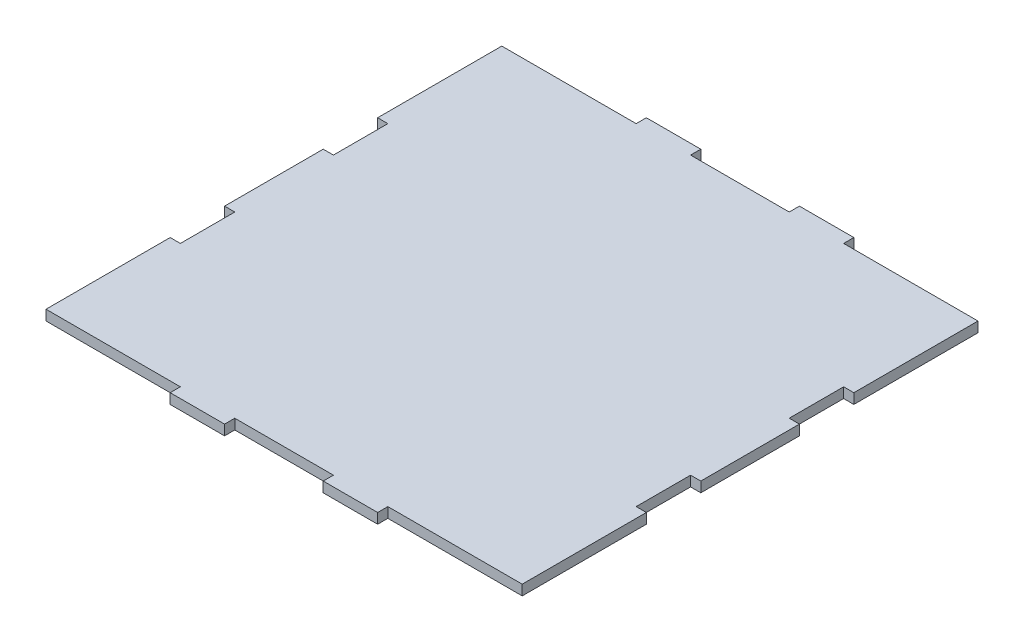
ISO-10303-21;
HEADER;
FILE_DESCRIPTION(('STEP AP214'),'2;1');
FILE_NAME('part.step','',(''),(''),'','','');
FILE_SCHEMA(('AUTOMOTIVE_DESIGN { 1 0 10303 214 1 1 1 1 }'));
ENDSEC;
DATA;
#1=APPLICATION_CONTEXT('core data for automotive mechanical design processes');
#2=APPLICATION_PROTOCOL_DEFINITION('international standard','automotive_design',2000,#1);
#3=PRODUCT_CONTEXT('',#1,'mechanical');
#4=PRODUCT('Part','Part','',(#3));
#5=PRODUCT_RELATED_PRODUCT_CATEGORY('part','',(#4));
#6=PRODUCT_DEFINITION_FORMATION('','',#4);
#7=PRODUCT_DEFINITION_CONTEXT('part definition',#1,'design');
#8=PRODUCT_DEFINITION('design','',#6,#7);
#9=PRODUCT_DEFINITION_SHAPE('','',#8);
#10=(LENGTH_UNIT() NAMED_UNIT(*) SI_UNIT(.MILLI.,.METRE.));
#11=(NAMED_UNIT(*) PLANE_ANGLE_UNIT() SI_UNIT($,.RADIAN.));
#12=(NAMED_UNIT(*) SI_UNIT($,.STERADIAN.) SOLID_ANGLE_UNIT());
#13=UNCERTAINTY_MEASURE_WITH_UNIT(LENGTH_MEASURE(1.E-05),#10,'distance_accuracy_value','');
#14=(GEOMETRIC_REPRESENTATION_CONTEXT(3) GLOBAL_UNCERTAINTY_ASSIGNED_CONTEXT((#13)) GLOBAL_UNIT_ASSIGNED_CONTEXT((#10,
#11,#12)) REPRESENTATION_CONTEXT('',''));
#15=CARTESIAN_POINT('',(0.,0.,0.));
#16=DIRECTION('',(0.,0.,1.));
#17=DIRECTION('',(1.,0.,0.));
#18=AXIS2_PLACEMENT_3D('',#15,#16,#17);
#19=CARTESIAN_POINT('',(70.,3.,70.));
#20=DIRECTION('',(-1.,0.,0.));
#21=DIRECTION('',(0.,0.,1.));
#22=AXIS2_PLACEMENT_3D('',#19,#20,#21);
#23=PLANE('',#22);
#24=DIRECTION('',(0.,0.,-1.));
#25=VECTOR('',#24,1.);
#26=CARTESIAN_POINT('',(70.,3.,70.));
#27=LINE('',#26,#25);
#28=CARTESIAN_POINT('',(70.,3.,-30.5));
#29=VERTEX_POINT('',#28);
#30=CARTESIAN_POINT('',(70.,3.,-67.));
#31=VERTEX_POINT('',#30);
#32=EDGE_CURVE('E342',#29,#31,#27,.T.);
#33=ORIENTED_EDGE('',*,*,#32,.F.);
#34=DIRECTION('',(0.,1.,0.));
#35=VECTOR('',#34,1.);
#36=CARTESIAN_POINT('',(70.,0.,-30.5));
#37=LINE('',#36,#35);
#38=CARTESIAN_POINT('',(70.,0.,-30.5));
#39=VERTEX_POINT('',#38);
#40=EDGE_CURVE('E578',#39,#29,#37,.T.);
#41=ORIENTED_EDGE('',*,*,#40,.F.);
#42=DIRECTION('',(0.,0.,-1.));
#43=VECTOR('',#42,1.);
#44=CARTESIAN_POINT('',(70.,0.,70.));
#45=LINE('',#44,#43);
#46=CARTESIAN_POINT('',(70.,0.,-67.));
#47=VERTEX_POINT('',#46);
#48=EDGE_CURVE('E306',#39,#47,#45,.T.);
#49=ORIENTED_EDGE('',*,*,#48,.T.);
#50=DIRECTION('',(0.,1.,0.));
#51=VECTOR('',#50,1.);
#52=CARTESIAN_POINT('',(70.,0.,-67.));
#53=LINE('',#52,#51);
#54=EDGE_CURVE('E408',#47,#31,#53,.T.);
#55=ORIENTED_EDGE('',*,*,#54,.T.);
#56=EDGE_LOOP('',(#33,#41,#49,#55));
#57=FACE_BOUND('',#56,.T.);
#58=ADVANCED_FACE('F39',(#57),#23,.F.);
#59=CARTESIAN_POINT('',(70.,0.,67.));
#60=VERTEX_POINT('',#59);
#61=CARTESIAN_POINT('',(70.,0.,30.5));
#62=VERTEX_POINT('',#61);
#63=EDGE_CURVE('E293',#60,#62,#45,.T.);
#64=ORIENTED_EDGE('',*,*,#63,.T.);
#65=DIRECTION('',(0.,1.,0.));
#66=VECTOR('',#65,1.);
#67=CARTESIAN_POINT('',(70.,0.,30.5));
#68=LINE('',#67,#66);
#69=CARTESIAN_POINT('',(70.,3.,30.5));
#70=VERTEX_POINT('',#69);
#71=EDGE_CURVE('E275',#62,#70,#68,.T.);
#72=ORIENTED_EDGE('',*,*,#71,.T.);
#73=CARTESIAN_POINT('',(70.,3.,67.));
#74=VERTEX_POINT('',#73);
#75=EDGE_CURVE('E337',#74,#70,#27,.T.);
#76=ORIENTED_EDGE('',*,*,#75,.F.);
#77=DIRECTION('',(0.,1.,0.));
#78=VECTOR('',#77,1.);
#79=CARTESIAN_POINT('',(70.,0.,67.));
#80=LINE('',#79,#78);
#81=EDGE_CURVE('E301',#60,#74,#80,.T.);
#82=ORIENTED_EDGE('',*,*,#81,.F.);
#83=EDGE_LOOP('',(#64,#72,#76,#82));
#84=FACE_BOUND('',#83,.T.);
#85=ADVANCED_FACE('F300',(#84),#23,.F.);
#86=CARTESIAN_POINT('',(-70.,3.,70.));
#87=DIRECTION('',(1.,0.,0.));
#88=DIRECTION('',(0.,0.,-1.));
#89=AXIS2_PLACEMENT_3D('',#86,#87,#88);
#90=PLANE('',#89);
#91=DIRECTION('',(0.,0.,1.));
#92=VECTOR('',#91,1.);
#93=CARTESIAN_POINT('',(-70.,3.,70.));
#94=LINE('',#93,#92);
#95=CARTESIAN_POINT('',(-70.,3.,30.5));
#96=VERTEX_POINT('',#95);
#97=CARTESIAN_POINT('',(-70.,3.,67.));
#98=VERTEX_POINT('',#97);
#99=EDGE_CURVE('E350',#96,#98,#94,.T.);
#100=ORIENTED_EDGE('',*,*,#99,.F.);
#101=DIRECTION('',(0.,1.,0.));
#102=VECTOR('',#101,1.);
#103=CARTESIAN_POINT('',(-70.,0.,30.5));
#104=LINE('',#103,#102);
#105=CARTESIAN_POINT('',(-70.,0.,30.5));
#106=VERTEX_POINT('',#105);
#107=EDGE_CURVE('E544',#106,#96,#104,.T.);
#108=ORIENTED_EDGE('',*,*,#107,.F.);
#109=DIRECTION('',(0.,0.,1.));
#110=VECTOR('',#109,1.);
#111=CARTESIAN_POINT('',(-70.,0.,70.));
#112=LINE('',#111,#110);
#113=CARTESIAN_POINT('',(-70.,0.,67.));
#114=VERTEX_POINT('',#113);
#115=EDGE_CURVE('E671',#106,#114,#112,.T.);
#116=ORIENTED_EDGE('',*,*,#115,.T.);
#117=DIRECTION('',(0.,1.,0.));
#118=VECTOR('',#117,1.);
#119=CARTESIAN_POINT('',(-70.,0.,67.));
#120=LINE('',#119,#118);
#121=EDGE_CURVE('E465',#114,#98,#120,.T.);
#122=ORIENTED_EDGE('',*,*,#121,.T.);
#123=EDGE_LOOP('',(#100,#108,#116,#122));
#124=FACE_BOUND('',#123,.T.);
#125=ADVANCED_FACE('F668',(#124),#90,.F.);
#126=CARTESIAN_POINT('',(-70.,0.,-67.));
#127=VERTEX_POINT('',#126);
#128=CARTESIAN_POINT('',(-70.,0.,-30.5));
#129=VERTEX_POINT('',#128);
#130=EDGE_CURVE('E674',#127,#129,#112,.T.);
#131=ORIENTED_EDGE('',*,*,#130,.T.);
#132=DIRECTION('',(0.,1.,0.));
#133=VECTOR('',#132,1.);
#134=CARTESIAN_POINT('',(-70.,0.,-30.5));
#135=LINE('',#134,#133);
#136=CARTESIAN_POINT('',(-70.,3.,-30.5));
#137=VERTEX_POINT('',#136);
#138=EDGE_CURVE('E608',#129,#137,#135,.T.);
#139=ORIENTED_EDGE('',*,*,#138,.T.);
#140=CARTESIAN_POINT('',(-70.,3.,-67.));
#141=VERTEX_POINT('',#140);
#142=EDGE_CURVE('E346',#141,#137,#94,.T.);
#143=ORIENTED_EDGE('',*,*,#142,.F.);
#144=DIRECTION('',(0.,1.,0.));
#145=VECTOR('',#144,1.);
#146=CARTESIAN_POINT('',(-70.,0.,-67.));
#147=LINE('',#146,#145);
#148=EDGE_CURVE('E328',#127,#141,#147,.T.);
#149=ORIENTED_EDGE('',*,*,#148,.F.);
#150=EDGE_LOOP('',(#131,#139,#143,#149));
#151=FACE_BOUND('',#150,.T.);
#152=ADVANCED_FACE('F767',(#151),#90,.F.);
#153=CARTESIAN_POINT('',(-70.,3.,-70.));
#154=DIRECTION('',(0.,0.,1.));
#155=DIRECTION('',(1.,0.,0.));
#156=AXIS2_PLACEMENT_3D('',#153,#154,#155);
#157=PLANE('',#156);
#158=DIRECTION('',(-1.,0.,0.));
#159=VECTOR('',#158,1.);
#160=CARTESIAN_POINT('',(-70.,3.,-70.));
#161=LINE('',#160,#159);
#162=CARTESIAN_POINT('',(30.5,3.,-70.));
#163=VERTEX_POINT('',#162);
#164=CARTESIAN_POINT('',(14.5,3.,-70.));
#165=VERTEX_POINT('',#164);
#166=EDGE_CURVE('E345',#163,#165,#161,.T.);
#167=ORIENTED_EDGE('',*,*,#166,.F.);
#168=DIRECTION('',(0.,1.,0.));
#169=VECTOR('',#168,1.);
#170=CARTESIAN_POINT('',(30.5,0.,-70.));
#171=LINE('',#170,#169);
#172=CARTESIAN_POINT('',(30.5,0.,-70.));
#173=VERTEX_POINT('',#172);
#174=EDGE_CURVE('E404',#173,#163,#171,.T.);
#175=ORIENTED_EDGE('',*,*,#174,.F.);
#176=DIRECTION('',(-1.,0.,0.));
#177=VECTOR('',#176,1.);
#178=CARTESIAN_POINT('',(-70.,0.,-70.));
#179=LINE('',#178,#177);
#180=CARTESIAN_POINT('',(14.5,0.,-70.));
#181=VERTEX_POINT('',#180);
#182=EDGE_CURVE('E310',#173,#181,#179,.T.);
#183=ORIENTED_EDGE('',*,*,#182,.T.);
#184=DIRECTION('',(0.,1.,0.));
#185=VECTOR('',#184,1.);
#186=CARTESIAN_POINT('',(14.5,0.,-70.));
#187=LINE('',#186,#185);
#188=EDGE_CURVE('E400',#181,#165,#187,.T.);
#189=ORIENTED_EDGE('',*,*,#188,.T.);
#190=EDGE_LOOP('',(#167,#175,#183,#189));
#191=FACE_BOUND('',#190,.T.);
#192=ADVANCED_FACE('F719',(#191),#157,.F.);
#193=CARTESIAN_POINT('',(-70.,3.,70.));
#194=DIRECTION('',(0.,0.,-1.));
#195=DIRECTION('',(-1.,0.,0.));
#196=AXIS2_PLACEMENT_3D('',#193,#194,#195);
#197=PLANE('',#196);
#198=DIRECTION('',(1.,0.,0.));
#199=VECTOR('',#198,1.);
#200=CARTESIAN_POINT('',(-70.,0.,70.));
#201=LINE('',#200,#199);
#202=CARTESIAN_POINT('',(14.5,0.,70.));
#203=VERTEX_POINT('',#202);
#204=CARTESIAN_POINT('',(30.5,0.,70.));
#205=VERTEX_POINT('',#204);
#206=EDGE_CURVE('E43',#203,#205,#201,.T.);
#207=ORIENTED_EDGE('',*,*,#206,.T.);
#208=DIRECTION('',(0.,1.,0.));
#209=VECTOR('',#208,1.);
#210=CARTESIAN_POINT('',(30.5,0.,70.));
#211=LINE('',#210,#209);
#212=CARTESIAN_POINT('',(30.5,3.,70.));
#213=VERTEX_POINT('',#212);
#214=EDGE_CURVE('E371',#205,#213,#211,.T.);
#215=ORIENTED_EDGE('',*,*,#214,.T.);
#216=DIRECTION('',(1.,0.,0.));
#217=VECTOR('',#216,1.);
#218=CARTESIAN_POINT('',(-70.,3.,70.));
#219=LINE('',#218,#217);
#220=CARTESIAN_POINT('',(14.5,3.,70.));
#221=VERTEX_POINT('',#220);
#222=EDGE_CURVE('E49',#221,#213,#219,.T.);
#223=ORIENTED_EDGE('',*,*,#222,.F.);
#224=DIRECTION('',(0.,1.,0.));
#225=VECTOR('',#224,1.);
#226=CARTESIAN_POINT('',(14.5,0.,70.));
#227=LINE('',#226,#225);
#228=EDGE_CURVE('E369',#203,#221,#227,.T.);
#229=ORIENTED_EDGE('',*,*,#228,.F.);
#230=EDGE_LOOP('',(#207,#215,#223,#229));
#231=FACE_BOUND('',#230,.T.);
#232=ADVANCED_FACE('F368',(#231),#197,.F.);
#233=CARTESIAN_POINT('',(70.,0.,14.5));
#234=VERTEX_POINT('',#233);
#235=CARTESIAN_POINT('',(70.,0.,-14.5));
#236=VERTEX_POINT('',#235);
#237=EDGE_CURVE('E304',#234,#236,#45,.T.);
#238=ORIENTED_EDGE('',*,*,#237,.T.);
#239=DIRECTION('',(0.,1.,0.));
#240=VECTOR('',#239,1.);
#241=CARTESIAN_POINT('',(70.,0.,-14.5));
#242=LINE('',#241,#240);
#243=CARTESIAN_POINT('',(70.,3.,-14.5));
#244=VERTEX_POINT('',#243);
#245=EDGE_CURVE('E581',#236,#244,#242,.T.);
#246=ORIENTED_EDGE('',*,*,#245,.T.);
#247=CARTESIAN_POINT('',(70.,3.,14.5));
#248=VERTEX_POINT('',#247);
#249=EDGE_CURVE('E341',#248,#244,#27,.T.);
#250=ORIENTED_EDGE('',*,*,#249,.F.);
#251=DIRECTION('',(0.,1.,0.));
#252=VECTOR('',#251,1.);
#253=CARTESIAN_POINT('',(70.,0.,14.5));
#254=LINE('',#253,#252);
#255=EDGE_CURVE('E286',#234,#248,#254,.T.);
#256=ORIENTED_EDGE('',*,*,#255,.F.);
#257=EDGE_LOOP('',(#238,#246,#250,#256));
#258=FACE_BOUND('',#257,.T.);
#259=ADVANCED_FACE('F41',(#258),#23,.F.);
#260=CARTESIAN_POINT('',(-14.5,3.,-70.));
#261=VERTEX_POINT('',#260);
#262=CARTESIAN_POINT('',(-30.5,3.,-70.));
#263=VERTEX_POINT('',#262);
#264=EDGE_CURVE('E340',#261,#263,#161,.T.);
#265=ORIENTED_EDGE('',*,*,#264,.F.);
#266=DIRECTION('',(0.,1.,0.));
#267=VECTOR('',#266,1.);
#268=CARTESIAN_POINT('',(-14.5,0.,-70.));
#269=LINE('',#268,#267);
#270=CARTESIAN_POINT('',(-14.5,0.,-70.));
#271=VERTEX_POINT('',#270);
#272=EDGE_CURVE('E426',#271,#261,#269,.T.);
#273=ORIENTED_EDGE('',*,*,#272,.F.);
#274=CARTESIAN_POINT('',(-30.5,0.,-70.));
#275=VERTEX_POINT('',#274);
#276=EDGE_CURVE('E303',#271,#275,#179,.T.);
#277=ORIENTED_EDGE('',*,*,#276,.T.);
#278=DIRECTION('',(0.,1.,0.));
#279=VECTOR('',#278,1.);
#280=CARTESIAN_POINT('',(-30.5,0.,-70.));
#281=LINE('',#280,#279);
#282=EDGE_CURVE('E314',#275,#263,#281,.T.);
#283=ORIENTED_EDGE('',*,*,#282,.T.);
#284=EDGE_LOOP('',(#265,#273,#277,#283));
#285=FACE_BOUND('',#284,.T.);
#286=ADVANCED_FACE('F757',(#285),#157,.F.);
#287=CARTESIAN_POINT('',(-70.,0.,-14.5));
#288=VERTEX_POINT('',#287);
#289=CARTESIAN_POINT('',(-70.,0.,14.5));
#290=VERTEX_POINT('',#289);
#291=EDGE_CURVE('E673',#288,#290,#112,.T.);
#292=ORIENTED_EDGE('',*,*,#291,.T.);
#293=DIRECTION('',(0.,1.,0.));
#294=VECTOR('',#293,1.);
#295=CARTESIAN_POINT('',(-70.,0.,14.5));
#296=LINE('',#295,#294);
#297=CARTESIAN_POINT('',(-70.,3.,14.5));
#298=VERTEX_POINT('',#297);
#299=EDGE_CURVE('E547',#290,#298,#296,.T.);
#300=ORIENTED_EDGE('',*,*,#299,.T.);
#301=CARTESIAN_POINT('',(-70.,3.,-14.5));
#302=VERTEX_POINT('',#301);
#303=EDGE_CURVE('E349',#302,#298,#94,.T.);
#304=ORIENTED_EDGE('',*,*,#303,.F.);
#305=DIRECTION('',(0.,1.,0.));
#306=VECTOR('',#305,1.);
#307=CARTESIAN_POINT('',(-70.,0.,-14.5));
#308=LINE('',#307,#306);
#309=EDGE_CURVE('E598',#288,#302,#308,.T.);
#310=ORIENTED_EDGE('',*,*,#309,.F.);
#311=EDGE_LOOP('',(#292,#300,#304,#310));
#312=FACE_BOUND('',#311,.T.);
#313=ADVANCED_FACE('F733',(#312),#90,.F.);
#314=CARTESIAN_POINT('',(-30.5,3.,70.));
#315=VERTEX_POINT('',#314);
#316=CARTESIAN_POINT('',(-14.5,3.,70.));
#317=VERTEX_POINT('',#316);
#318=EDGE_CURVE('E11',#315,#317,#219,.T.);
#319=ORIENTED_EDGE('',*,*,#318,.F.);
#320=DIRECTION('',(0.,1.,0.));
#321=VECTOR('',#320,1.);
#322=CARTESIAN_POINT('',(-30.5,0.,70.));
#323=LINE('',#322,#321);
#324=CARTESIAN_POINT('',(-30.5,0.,70.));
#325=VERTEX_POINT('',#324);
#326=EDGE_CURVE('E458',#325,#315,#323,.T.);
#327=ORIENTED_EDGE('',*,*,#326,.F.);
#328=CARTESIAN_POINT('',(-14.5,0.,70.));
#329=VERTEX_POINT('',#328);
#330=EDGE_CURVE('E685',#325,#329,#201,.T.);
#331=ORIENTED_EDGE('',*,*,#330,.T.);
#332=DIRECTION('',(0.,1.,0.));
#333=VECTOR('',#332,1.);
#334=CARTESIAN_POINT('',(-14.5,0.,70.));
#335=LINE('',#334,#333);
#336=EDGE_CURVE('E646',#329,#317,#335,.T.);
#337=ORIENTED_EDGE('',*,*,#336,.T.);
#338=EDGE_LOOP('',(#319,#327,#331,#337));
#339=FACE_BOUND('',#338,.T.);
#340=ADVANCED_FACE('F763',(#339),#197,.F.);
#341=CARTESIAN_POINT('',(0.,3.,0.));
#342=DIRECTION('',(0.,-1.,0.));
#343=DIRECTION('',(0.,0.,-1.));
#344=AXIS2_PLACEMENT_3D('',#341,#342,#343);
#345=PLANE('',#344);
#346=DIRECTION('',(0.,0.,-1.));
#347=VECTOR('',#346,1.);
#348=CARTESIAN_POINT('',(-67.,3.,30.5));
#349=LINE('',#348,#347);
#350=CARTESIAN_POINT('',(-67.,3.,30.5));
#351=VERTEX_POINT('',#350);
#352=CARTESIAN_POINT('',(-67.,3.,14.5));
#353=VERTEX_POINT('',#352);
#354=EDGE_CURVE('E529',#351,#353,#349,.T.);
#355=ORIENTED_EDGE('',*,*,#354,.F.);
#356=DIRECTION('',(1.,0.,0.));
#357=VECTOR('',#356,1.);
#358=CARTESIAN_POINT('',(-70.,3.,30.5));
#359=LINE('',#358,#357);
#360=EDGE_CURVE('E521',#96,#351,#359,.T.);
#361=ORIENTED_EDGE('',*,*,#360,.F.);
#362=ORIENTED_EDGE('',*,*,#99,.T.);
#363=DIRECTION('',(-1.,0.,0.));
#364=VECTOR('',#363,1.);
#365=CARTESIAN_POINT('',(-70.,3.,67.));
#366=LINE('',#365,#364);
#367=CARTESIAN_POINT('',(-30.5,3.,67.));
#368=VERTEX_POINT('',#367);
#369=EDGE_CURVE('E476',#368,#98,#366,.T.);
#370=ORIENTED_EDGE('',*,*,#369,.F.);
#371=DIRECTION('',(0.,0.,-1.));
#372=VECTOR('',#371,1.);
#373=CARTESIAN_POINT('',(-30.5,3.,67.));
#374=LINE('',#373,#372);
#375=EDGE_CURVE('E380',#315,#368,#374,.T.);
#376=ORIENTED_EDGE('',*,*,#375,.F.);
#377=ORIENTED_EDGE('',*,*,#318,.T.);
#378=DIRECTION('',(0.,0.,1.));
#379=VECTOR('',#378,1.);
#380=CARTESIAN_POINT('',(-14.5,3.,70.));
#381=LINE('',#380,#379);
#382=CARTESIAN_POINT('',(-14.5,3.,67.));
#383=VERTEX_POINT('',#382);
#384=EDGE_CURVE('E637',#383,#317,#381,.T.);
#385=ORIENTED_EDGE('',*,*,#384,.F.);
#386=DIRECTION('',(-1.,0.,0.));
#387=VECTOR('',#386,1.);
#388=CARTESIAN_POINT('',(-14.5,3.,67.));
#389=LINE('',#388,#387);
#390=CARTESIAN_POINT('',(14.5,3.,67.));
#391=VERTEX_POINT('',#390);
#392=EDGE_CURVE('E612',#391,#383,#389,.T.);
#393=ORIENTED_EDGE('',*,*,#392,.F.);
#394=DIRECTION('',(0.,0.,-1.));
#395=VECTOR('',#394,1.);
#396=CARTESIAN_POINT('',(14.5,3.,67.));
#397=LINE('',#396,#395);
#398=EDGE_CURVE('E363',#221,#391,#397,.T.);
#399=ORIENTED_EDGE('',*,*,#398,.F.);
#400=ORIENTED_EDGE('',*,*,#222,.T.);
#401=DIRECTION('',(0.,0.,1.));
#402=VECTOR('',#401,1.);
#403=CARTESIAN_POINT('',(30.5,3.,67.));
#404=LINE('',#403,#402);
#405=CARTESIAN_POINT('',(30.5,3.,67.));
#406=VERTEX_POINT('',#405);
#407=EDGE_CURVE('E360',#406,#213,#404,.T.);
#408=ORIENTED_EDGE('',*,*,#407,.F.);
#409=DIRECTION('',(-1.,0.,0.));
#410=VECTOR('',#409,1.);
#411=CARTESIAN_POINT('',(70.,3.,67.));
#412=LINE('',#411,#410);
#413=EDGE_CURVE('E407',#74,#406,#412,.T.);
#414=ORIENTED_EDGE('',*,*,#413,.F.);
#415=ORIENTED_EDGE('',*,*,#75,.T.);
#416=DIRECTION('',(1.,0.,0.));
#417=VECTOR('',#416,1.);
#418=CARTESIAN_POINT('',(70.,3.,30.5));
#419=LINE('',#418,#417);
#420=CARTESIAN_POINT('',(67.,3.,30.5));
#421=VERTEX_POINT('',#420);
#422=EDGE_CURVE('E280',#421,#70,#419,.T.);
#423=ORIENTED_EDGE('',*,*,#422,.F.);
#424=DIRECTION('',(0.,0.,1.));
#425=VECTOR('',#424,1.);
#426=CARTESIAN_POINT('',(67.,3.,30.5));
#427=LINE('',#426,#425);
#428=CARTESIAN_POINT('',(67.,3.,14.5));
#429=VERTEX_POINT('',#428);
#430=EDGE_CURVE('E297',#429,#421,#427,.T.);
#431=ORIENTED_EDGE('',*,*,#430,.F.);
#432=DIRECTION('',(-1.,0.,0.));
#433=VECTOR('',#432,1.);
#434=CARTESIAN_POINT('',(67.,3.,14.5));
#435=LINE('',#434,#433);
#436=EDGE_CURVE('E497',#248,#429,#435,.T.);
#437=ORIENTED_EDGE('',*,*,#436,.F.);
#438=ORIENTED_EDGE('',*,*,#249,.T.);
#439=DIRECTION('',(1.,0.,0.));
#440=VECTOR('',#439,1.);
#441=CARTESIAN_POINT('',(67.,3.,-14.5));
#442=LINE('',#441,#440);
#443=CARTESIAN_POINT('',(67.,3.,-14.5));
#444=VERTEX_POINT('',#443);
#445=EDGE_CURVE('E570',#444,#244,#442,.T.);
#446=ORIENTED_EDGE('',*,*,#445,.F.);
#447=DIRECTION('',(0.,0.,1.));
#448=VECTOR('',#447,1.);
#449=CARTESIAN_POINT('',(67.,3.,-30.5));
#450=LINE('',#449,#448);
#451=CARTESIAN_POINT('',(67.,3.,-30.5));
#452=VERTEX_POINT('',#451);
#453=EDGE_CURVE('E510',#452,#444,#450,.T.);
#454=ORIENTED_EDGE('',*,*,#453,.F.);
#455=DIRECTION('',(-1.,0.,0.));
#456=VECTOR('',#455,1.);
#457=CARTESIAN_POINT('',(70.,3.,-30.5));
#458=LINE('',#457,#456);
#459=EDGE_CURVE('E558',#29,#452,#458,.T.);
#460=ORIENTED_EDGE('',*,*,#459,.F.);
#461=ORIENTED_EDGE('',*,*,#32,.T.);
#462=DIRECTION('',(1.,0.,0.));
#463=VECTOR('',#462,1.);
#464=CARTESIAN_POINT('',(70.,3.,-67.));
#465=LINE('',#464,#463);
#466=CARTESIAN_POINT('',(30.5,3.,-67.));
#467=VERTEX_POINT('',#466);
#468=EDGE_CURVE('E391',#467,#31,#465,.T.);
#469=ORIENTED_EDGE('',*,*,#468,.F.);
#470=DIRECTION('',(0.,0.,1.));
#471=VECTOR('',#470,1.);
#472=CARTESIAN_POINT('',(30.5,3.,-67.));
#473=LINE('',#472,#471);
#474=EDGE_CURVE('E396',#163,#467,#473,.T.);
#475=ORIENTED_EDGE('',*,*,#474,.F.);
#476=ORIENTED_EDGE('',*,*,#166,.T.);
#477=DIRECTION('',(0.,0.,-1.));
#478=VECTOR('',#477,1.);
#479=CARTESIAN_POINT('',(14.5,3.,-67.));
#480=LINE('',#479,#478);
#481=CARTESIAN_POINT('',(14.5,3.,-67.));
#482=VERTEX_POINT('',#481);
#483=EDGE_CURVE('E418',#482,#165,#480,.T.);
#484=ORIENTED_EDGE('',*,*,#483,.F.);
#485=DIRECTION('',(1.,0.,0.));
#486=VECTOR('',#485,1.);
#487=CARTESIAN_POINT('',(-14.5,3.,-67.));
#488=LINE('',#487,#486);
#489=CARTESIAN_POINT('',(-14.5,3.,-67.));
#490=VERTEX_POINT('',#489);
#491=EDGE_CURVE('E431',#490,#482,#488,.T.);
#492=ORIENTED_EDGE('',*,*,#491,.F.);
#493=DIRECTION('',(0.,0.,1.));
#494=VECTOR('',#493,1.);
#495=CARTESIAN_POINT('',(-14.5,3.,-70.));
#496=LINE('',#495,#494);
#497=EDGE_CURVE('E427',#261,#490,#496,.T.);
#498=ORIENTED_EDGE('',*,*,#497,.F.);
#499=ORIENTED_EDGE('',*,*,#264,.T.);
#500=DIRECTION('',(0.,0.,-1.));
#501=VECTOR('',#500,1.);
#502=CARTESIAN_POINT('',(-30.5,3.,-67.));
#503=LINE('',#502,#501);
#504=CARTESIAN_POINT('',(-30.5,3.,-67.));
#505=VERTEX_POINT('',#504);
#506=EDGE_CURVE('E331',#505,#263,#503,.T.);
#507=ORIENTED_EDGE('',*,*,#506,.F.);
#508=DIRECTION('',(1.,0.,0.));
#509=VECTOR('',#508,1.);
#510=CARTESIAN_POINT('',(-70.,3.,-67.));
#511=LINE('',#510,#509);
#512=EDGE_CURVE('E455',#141,#505,#511,.T.);
#513=ORIENTED_EDGE('',*,*,#512,.F.);
#514=ORIENTED_EDGE('',*,*,#142,.T.);
#515=DIRECTION('',(-1.,0.,0.));
#516=VECTOR('',#515,1.);
#517=CARTESIAN_POINT('',(-70.,3.,-30.5));
#518=LINE('',#517,#516);
#519=CARTESIAN_POINT('',(-67.,3.,-30.5));
#520=VERTEX_POINT('',#519);
#521=EDGE_CURVE('E591',#520,#137,#518,.T.);
#522=ORIENTED_EDGE('',*,*,#521,.F.);
#523=DIRECTION('',(0.,0.,-1.));
#524=VECTOR('',#523,1.);
#525=CARTESIAN_POINT('',(-67.,3.,-30.5));
#526=LINE('',#525,#524);
#527=CARTESIAN_POINT('',(-67.,3.,-14.5));
#528=VERTEX_POINT('',#527);
#529=EDGE_CURVE('E602',#528,#520,#526,.T.);
#530=ORIENTED_EDGE('',*,*,#529,.F.);
#531=DIRECTION('',(1.,0.,0.));
#532=VECTOR('',#531,1.);
#533=CARTESIAN_POINT('',(-67.,3.,-14.5));
#534=LINE('',#533,#532);
#535=EDGE_CURVE('E543',#302,#528,#534,.T.);
#536=ORIENTED_EDGE('',*,*,#535,.F.);
#537=ORIENTED_EDGE('',*,*,#303,.T.);
#538=DIRECTION('',(-1.,0.,0.));
#539=VECTOR('',#538,1.);
#540=CARTESIAN_POINT('',(-67.,3.,14.5));
#541=LINE('',#540,#539);
#542=EDGE_CURVE('E533',#353,#298,#541,.T.);
#543=ORIENTED_EDGE('',*,*,#542,.F.);
#544=EDGE_LOOP('',(#355,#361,#362,#370,#376,#377,#385,#393,#399,#400,#408,#414,#415,#423,#431,
#437,#438,#446,#454,#460,#461,#469,#475,#476,#484,#492,#498,#499,#507,#513,#514,#522,#530,#536,
#537,#543));
#545=FACE_BOUND('',#544,.T.);
#546=ADVANCED_FACE('F358',(#545),#345,.F.);
#547=CARTESIAN_POINT('',(0.,0.,0.));
#548=DIRECTION('',(0.,-1.,0.));
#549=DIRECTION('',(0.,0.,-1.));
#550=AXIS2_PLACEMENT_3D('',#547,#548,#549);
#551=PLANE('',#550);
#552=DIRECTION('',(1.,0.,0.));
#553=VECTOR('',#552,1.);
#554=CARTESIAN_POINT('',(-70.,0.,30.5));
#555=LINE('',#554,#553);
#556=CARTESIAN_POINT('',(-67.,0.,30.5));
#557=VERTEX_POINT('',#556);
#558=EDGE_CURVE('E525',#106,#557,#555,.T.);
#559=ORIENTED_EDGE('',*,*,#558,.T.);
#560=DIRECTION('',(0.,0.,-1.));
#561=VECTOR('',#560,1.);
#562=CARTESIAN_POINT('',(-67.,0.,30.5));
#563=LINE('',#562,#561);
#564=CARTESIAN_POINT('',(-67.,0.,14.5));
#565=VERTEX_POINT('',#564);
#566=EDGE_CURVE('E516',#557,#565,#563,.T.);
#567=ORIENTED_EDGE('',*,*,#566,.T.);
#568=DIRECTION('',(-1.,0.,0.));
#569=VECTOR('',#568,1.);
#570=CARTESIAN_POINT('',(-67.,0.,14.5));
#571=LINE('',#570,#569);
#572=EDGE_CURVE('E520',#565,#290,#571,.T.);
#573=ORIENTED_EDGE('',*,*,#572,.T.);
#574=ORIENTED_EDGE('',*,*,#291,.F.);
#575=DIRECTION('',(1.,0.,0.));
#576=VECTOR('',#575,1.);
#577=CARTESIAN_POINT('',(-67.,0.,-14.5));
#578=LINE('',#577,#576);
#579=CARTESIAN_POINT('',(-67.,0.,-14.5));
#580=VERTEX_POINT('',#579);
#581=EDGE_CURVE('E587',#288,#580,#578,.T.);
#582=ORIENTED_EDGE('',*,*,#581,.T.);
#583=DIRECTION('',(0.,0.,-1.));
#584=VECTOR('',#583,1.);
#585=CARTESIAN_POINT('',(-67.,0.,-30.5));
#586=LINE('',#585,#584);
#587=CARTESIAN_POINT('',(-67.,0.,-30.5));
#588=VERTEX_POINT('',#587);
#589=EDGE_CURVE('E65',#580,#588,#586,.T.);
#590=ORIENTED_EDGE('',*,*,#589,.T.);
#591=DIRECTION('',(-1.,0.,0.));
#592=VECTOR('',#591,1.);
#593=CARTESIAN_POINT('',(-70.,0.,-30.5));
#594=LINE('',#593,#592);
#595=EDGE_CURVE('E594',#588,#129,#594,.T.);
#596=ORIENTED_EDGE('',*,*,#595,.T.);
#597=ORIENTED_EDGE('',*,*,#130,.F.);
#598=DIRECTION('',(1.,0.,0.));
#599=VECTOR('',#598,1.);
#600=CARTESIAN_POINT('',(-70.,0.,-67.));
#601=LINE('',#600,#599);
#602=CARTESIAN_POINT('',(-30.5,0.,-67.));
#603=VERTEX_POINT('',#602);
#604=EDGE_CURVE('E449',#127,#603,#601,.T.);
#605=ORIENTED_EDGE('',*,*,#604,.T.);
#606=DIRECTION('',(0.,0.,-1.));
#607=VECTOR('',#606,1.);
#608=CARTESIAN_POINT('',(-30.5,0.,-67.));
#609=LINE('',#608,#607);
#610=EDGE_CURVE('E336',#603,#275,#609,.T.);
#611=ORIENTED_EDGE('',*,*,#610,.T.);
#612=ORIENTED_EDGE('',*,*,#276,.F.);
#613=DIRECTION('',(0.,0.,1.));
#614=VECTOR('',#613,1.);
#615=CARTESIAN_POINT('',(-14.5,0.,-70.));
#616=LINE('',#615,#614);
#617=CARTESIAN_POINT('',(-14.5,0.,-67.));
#618=VERTEX_POINT('',#617);
#619=EDGE_CURVE('E413',#271,#618,#616,.T.);
#620=ORIENTED_EDGE('',*,*,#619,.T.);
#621=DIRECTION('',(1.,0.,0.));
#622=VECTOR('',#621,1.);
#623=CARTESIAN_POINT('',(-14.5,0.,-67.));
#624=LINE('',#623,#622);
#625=CARTESIAN_POINT('',(14.5,0.,-67.));
#626=VERTEX_POINT('',#625);
#627=EDGE_CURVE('E417',#618,#626,#624,.T.);
#628=ORIENTED_EDGE('',*,*,#627,.T.);
#629=DIRECTION('',(0.,0.,-1.));
#630=VECTOR('',#629,1.);
#631=CARTESIAN_POINT('',(14.5,0.,-67.));
#632=LINE('',#631,#630);
#633=EDGE_CURVE('E422',#626,#181,#632,.T.);
#634=ORIENTED_EDGE('',*,*,#633,.T.);
#635=ORIENTED_EDGE('',*,*,#182,.F.);
#636=DIRECTION('',(0.,0.,1.));
#637=VECTOR('',#636,1.);
#638=CARTESIAN_POINT('',(30.5,0.,-67.));
#639=LINE('',#638,#637);
#640=CARTESIAN_POINT('',(30.5,0.,-67.));
#641=VERTEX_POINT('',#640);
#642=EDGE_CURVE('E386',#173,#641,#639,.T.);
#643=ORIENTED_EDGE('',*,*,#642,.T.);
#644=DIRECTION('',(1.,0.,0.));
#645=VECTOR('',#644,1.);
#646=CARTESIAN_POINT('',(70.,0.,-67.));
#647=LINE('',#646,#645);
#648=EDGE_CURVE('E390',#641,#47,#647,.T.);
#649=ORIENTED_EDGE('',*,*,#648,.T.);
#650=ORIENTED_EDGE('',*,*,#48,.F.);
#651=DIRECTION('',(-1.,0.,0.));
#652=VECTOR('',#651,1.);
#653=CARTESIAN_POINT('',(70.,0.,-30.5));
#654=LINE('',#653,#652);
#655=CARTESIAN_POINT('',(67.,0.,-30.5));
#656=VERTEX_POINT('',#655);
#657=EDGE_CURVE('E562',#39,#656,#654,.T.);
#658=ORIENTED_EDGE('',*,*,#657,.T.);
#659=DIRECTION('',(0.,0.,1.));
#660=VECTOR('',#659,1.);
#661=CARTESIAN_POINT('',(67.,0.,-30.5));
#662=LINE('',#661,#660);
#663=CARTESIAN_POINT('',(67.,0.,-14.5));
#664=VERTEX_POINT('',#663);
#665=EDGE_CURVE('E553',#656,#664,#662,.T.);
#666=ORIENTED_EDGE('',*,*,#665,.T.);
#667=DIRECTION('',(1.,0.,0.));
#668=VECTOR('',#667,1.);
#669=CARTESIAN_POINT('',(67.,0.,-14.5));
#670=LINE('',#669,#668);
#671=EDGE_CURVE('E557',#664,#236,#670,.T.);
#672=ORIENTED_EDGE('',*,*,#671,.T.);
#673=ORIENTED_EDGE('',*,*,#237,.F.);
#674=DIRECTION('',(-1.,0.,0.));
#675=VECTOR('',#674,1.);
#676=CARTESIAN_POINT('',(67.,0.,14.5));
#677=LINE('',#676,#675);
#678=CARTESIAN_POINT('',(67.,0.,14.5));
#679=VERTEX_POINT('',#678);
#680=EDGE_CURVE('E296',#234,#679,#677,.T.);
#681=ORIENTED_EDGE('',*,*,#680,.T.);
#682=DIRECTION('',(0.,0.,1.));
#683=VECTOR('',#682,1.);
#684=CARTESIAN_POINT('',(67.,0.,30.5));
#685=LINE('',#684,#683);
#686=CARTESIAN_POINT('',(67.,0.,30.5));
#687=VERTEX_POINT('',#686);
#688=EDGE_CURVE('E57',#679,#687,#685,.T.);
#689=ORIENTED_EDGE('',*,*,#688,.T.);
#690=DIRECTION('',(1.,0.,0.));
#691=VECTOR('',#690,1.);
#692=CARTESIAN_POINT('',(70.,0.,30.5));
#693=LINE('',#692,#691);
#694=EDGE_CURVE('E278',#687,#62,#693,.T.);
#695=ORIENTED_EDGE('',*,*,#694,.T.);
#696=ORIENTED_EDGE('',*,*,#63,.F.);
#697=DIRECTION('',(-1.,0.,0.));
#698=VECTOR('',#697,1.);
#699=CARTESIAN_POINT('',(70.,0.,67.));
#700=LINE('',#699,#698);
#701=CARTESIAN_POINT('',(30.5,0.,67.));
#702=VERTEX_POINT('',#701);
#703=EDGE_CURVE('E482',#60,#702,#700,.T.);
#704=ORIENTED_EDGE('',*,*,#703,.T.);
#705=DIRECTION('',(0.,0.,1.));
#706=VECTOR('',#705,1.);
#707=CARTESIAN_POINT('',(30.5,0.,67.));
#708=LINE('',#707,#706);
#709=EDGE_CURVE('E382',#702,#205,#708,.T.);
#710=ORIENTED_EDGE('',*,*,#709,.T.);
#711=ORIENTED_EDGE('',*,*,#206,.F.);
#712=DIRECTION('',(0.,0.,-1.));
#713=VECTOR('',#712,1.);
#714=CARTESIAN_POINT('',(14.5,0.,67.));
#715=LINE('',#714,#713);
#716=CARTESIAN_POINT('',(14.5,0.,67.));
#717=VERTEX_POINT('',#716);
#718=EDGE_CURVE('E629',#203,#717,#715,.T.);
#719=ORIENTED_EDGE('',*,*,#718,.T.);
#720=DIRECTION('',(-1.,0.,0.));
#721=VECTOR('',#720,1.);
#722=CARTESIAN_POINT('',(-14.5,0.,67.));
#723=LINE('',#722,#721);
#724=CARTESIAN_POINT('',(-14.5,0.,67.));
#725=VERTEX_POINT('',#724);
#726=EDGE_CURVE('E621',#717,#725,#723,.T.);
#727=ORIENTED_EDGE('',*,*,#726,.T.);
#728=DIRECTION('',(0.,0.,1.));
#729=VECTOR('',#728,1.);
#730=CARTESIAN_POINT('',(-14.5,0.,70.));
#731=LINE('',#730,#729);
#732=EDGE_CURVE('E625',#725,#329,#731,.T.);
#733=ORIENTED_EDGE('',*,*,#732,.T.);
#734=ORIENTED_EDGE('',*,*,#330,.F.);
#735=DIRECTION('',(0.,0.,-1.));
#736=VECTOR('',#735,1.);
#737=CARTESIAN_POINT('',(-30.5,0.,67.));
#738=LINE('',#737,#736);
#739=CARTESIAN_POINT('',(-30.5,0.,67.));
#740=VERTEX_POINT('',#739);
#741=EDGE_CURVE('E652',#325,#740,#738,.T.);
#742=ORIENTED_EDGE('',*,*,#741,.T.);
#743=DIRECTION('',(-1.,0.,0.));
#744=VECTOR('',#743,1.);
#745=CARTESIAN_POINT('',(-70.,0.,67.));
#746=LINE('',#745,#744);
#747=EDGE_CURVE('E481',#740,#114,#746,.T.);
#748=ORIENTED_EDGE('',*,*,#747,.T.);
#749=ORIENTED_EDGE('',*,*,#115,.F.);
#750=EDGE_LOOP('',(#559,#567,#573,#574,#582,#590,#596,#597,#605,#611,#612,#620,#628,#634,#635,
#643,#649,#650,#658,#666,#672,#673,#681,#689,#695,#696,#704,#710,#711,#719,#727,#733,#734,#742,
#748,#749));
#751=FACE_BOUND('',#750,.T.);
#752=ADVANCED_FACE('F291',(#751),#551,.T.);
#753=CARTESIAN_POINT('',(-30.5,0.,-67.));
#754=DIRECTION('',(1.,0.,0.));
#755=DIRECTION('',(0.,0.,-1.));
#756=AXIS2_PLACEMENT_3D('',#753,#754,#755);
#757=PLANE('',#756);
#758=ORIENTED_EDGE('',*,*,#506,.T.);
#759=ORIENTED_EDGE('',*,*,#282,.F.);
#760=ORIENTED_EDGE('',*,*,#610,.F.);
#761=DIRECTION('',(0.,1.,0.));
#762=VECTOR('',#761,1.);
#763=CARTESIAN_POINT('',(-30.5,0.,-67.));
#764=LINE('',#763,#762);
#765=EDGE_CURVE('E322',#603,#505,#764,.T.);
#766=ORIENTED_EDGE('',*,*,#765,.T.);
#767=EDGE_LOOP('',(#758,#759,#760,#766));
#768=FACE_BOUND('',#767,.T.);
#769=ADVANCED_FACE('F816',(#768),#757,.F.);
#770=CARTESIAN_POINT('',(-70.,0.,-67.));
#771=DIRECTION('',(0.,0.,1.));
#772=DIRECTION('',(1.,0.,0.));
#773=AXIS2_PLACEMENT_3D('',#770,#771,#772);
#774=PLANE('',#773);
#775=ORIENTED_EDGE('',*,*,#512,.T.);
#776=ORIENTED_EDGE('',*,*,#765,.F.);
#777=ORIENTED_EDGE('',*,*,#604,.F.);
#778=ORIENTED_EDGE('',*,*,#148,.T.);
#779=EDGE_LOOP('',(#775,#776,#777,#778));
#780=FACE_BOUND('',#779,.T.);
#781=ADVANCED_FACE('F819',(#780),#774,.F.);
#782=CARTESIAN_POINT('',(-14.5,0.,67.));
#783=DIRECTION('',(0.,0.,-1.));
#784=DIRECTION('',(-1.,0.,0.));
#785=AXIS2_PLACEMENT_3D('',#782,#783,#784);
#786=PLANE('',#785);
#787=ORIENTED_EDGE('',*,*,#392,.T.);
#788=DIRECTION('',(0.,1.,0.));
#789=VECTOR('',#788,1.);
#790=CARTESIAN_POINT('',(-14.5,0.,67.));
#791=LINE('',#790,#789);
#792=EDGE_CURVE('E633',#725,#383,#791,.T.);
#793=ORIENTED_EDGE('',*,*,#792,.F.);
#794=ORIENTED_EDGE('',*,*,#726,.F.);
#795=DIRECTION('',(0.,1.,0.));
#796=VECTOR('',#795,1.);
#797=CARTESIAN_POINT('',(14.5,0.,67.));
#798=LINE('',#797,#796);
#799=EDGE_CURVE('E432',#717,#391,#798,.T.);
#800=ORIENTED_EDGE('',*,*,#799,.T.);
#801=EDGE_LOOP('',(#787,#793,#794,#800));
#802=FACE_BOUND('',#801,.T.);
#803=ADVANCED_FACE('F783',(#802),#786,.F.);
#804=CARTESIAN_POINT('',(14.5,0.,67.));
#805=DIRECTION('',(1.,0.,0.));
#806=DIRECTION('',(0.,0.,-1.));
#807=AXIS2_PLACEMENT_3D('',#804,#805,#806);
#808=PLANE('',#807);
#809=ORIENTED_EDGE('',*,*,#398,.T.);
#810=ORIENTED_EDGE('',*,*,#799,.F.);
#811=ORIENTED_EDGE('',*,*,#718,.F.);
#812=ORIENTED_EDGE('',*,*,#228,.T.);
#813=EDGE_LOOP('',(#809,#810,#811,#812));
#814=FACE_BOUND('',#813,.T.);
#815=ADVANCED_FACE('F785',(#814),#808,.F.);
#816=CARTESIAN_POINT('',(-14.5,0.,70.));
#817=DIRECTION('',(-1.,0.,0.));
#818=DIRECTION('',(0.,0.,1.));
#819=AXIS2_PLACEMENT_3D('',#816,#817,#818);
#820=PLANE('',#819);
#821=ORIENTED_EDGE('',*,*,#384,.T.);
#822=ORIENTED_EDGE('',*,*,#336,.F.);
#823=ORIENTED_EDGE('',*,*,#732,.F.);
#824=ORIENTED_EDGE('',*,*,#792,.T.);
#825=EDGE_LOOP('',(#821,#822,#823,#824));
#826=FACE_BOUND('',#825,.T.);
#827=ADVANCED_FACE('F779',(#826),#820,.F.);
#828=CARTESIAN_POINT('',(14.5,0.,-67.));
#829=DIRECTION('',(1.,0.,0.));
#830=DIRECTION('',(0.,0.,-1.));
#831=AXIS2_PLACEMENT_3D('',#828,#829,#830);
#832=PLANE('',#831);
#833=ORIENTED_EDGE('',*,*,#483,.T.);
#834=ORIENTED_EDGE('',*,*,#188,.F.);
#835=ORIENTED_EDGE('',*,*,#633,.F.);
#836=DIRECTION('',(0.,1.,0.));
#837=VECTOR('',#836,1.);
#838=CARTESIAN_POINT('',(14.5,0.,-67.));
#839=LINE('',#838,#837);
#840=EDGE_CURVE('E441',#626,#482,#839,.T.);
#841=ORIENTED_EDGE('',*,*,#840,.T.);
#842=EDGE_LOOP('',(#833,#834,#835,#841));
#843=FACE_BOUND('',#842,.T.);
#844=ADVANCED_FACE('F805',(#843),#832,.F.);
#845=CARTESIAN_POINT('',(-14.5,0.,-67.));
#846=DIRECTION('',(0.,0.,1.));
#847=DIRECTION('',(1.,0.,0.));
#848=AXIS2_PLACEMENT_3D('',#845,#846,#847);
#849=PLANE('',#848);
#850=ORIENTED_EDGE('',*,*,#491,.T.);
#851=ORIENTED_EDGE('',*,*,#840,.F.);
#852=ORIENTED_EDGE('',*,*,#627,.F.);
#853=DIRECTION('',(0.,1.,0.));
#854=VECTOR('',#853,1.);
#855=CARTESIAN_POINT('',(-14.5,0.,-67.));
#856=LINE('',#855,#854);
#857=EDGE_CURVE('E444',#618,#490,#856,.T.);
#858=ORIENTED_EDGE('',*,*,#857,.T.);
#859=EDGE_LOOP('',(#850,#851,#852,#858));
#860=FACE_BOUND('',#859,.T.);
#861=ADVANCED_FACE('F808',(#860),#849,.F.);
#862=CARTESIAN_POINT('',(-14.5,0.,-70.));
#863=DIRECTION('',(-1.,0.,0.));
#864=DIRECTION('',(0.,0.,1.));
#865=AXIS2_PLACEMENT_3D('',#862,#863,#864);
#866=PLANE('',#865);
#867=ORIENTED_EDGE('',*,*,#497,.T.);
#868=ORIENTED_EDGE('',*,*,#857,.F.);
#869=ORIENTED_EDGE('',*,*,#619,.F.);
#870=ORIENTED_EDGE('',*,*,#272,.T.);
#871=EDGE_LOOP('',(#867,#868,#869,#870));
#872=FACE_BOUND('',#871,.T.);
#873=ADVANCED_FACE('F804',(#872),#866,.F.);
#874=CARTESIAN_POINT('',(30.5,0.,-67.));
#875=DIRECTION('',(-1.,0.,0.));
#876=DIRECTION('',(0.,0.,1.));
#877=AXIS2_PLACEMENT_3D('',#874,#875,#876);
#878=PLANE('',#877);
#879=ORIENTED_EDGE('',*,*,#474,.T.);
#880=DIRECTION('',(0.,1.,0.));
#881=VECTOR('',#880,1.);
#882=CARTESIAN_POINT('',(30.5,0.,-67.));
#883=LINE('',#882,#881);
#884=EDGE_CURVE('E395',#641,#467,#883,.T.);
#885=ORIENTED_EDGE('',*,*,#884,.F.);
#886=ORIENTED_EDGE('',*,*,#642,.F.);
#887=ORIENTED_EDGE('',*,*,#174,.T.);
#888=EDGE_LOOP('',(#879,#885,#886,#887));
#889=FACE_BOUND('',#888,.T.);
#890=ADVANCED_FACE('F715',(#889),#878,.F.);
#891=CARTESIAN_POINT('',(70.,0.,-67.));
#892=DIRECTION('',(0.,0.,1.));
#893=DIRECTION('',(1.,0.,0.));
#894=AXIS2_PLACEMENT_3D('',#891,#892,#893);
#895=PLANE('',#894);
#896=ORIENTED_EDGE('',*,*,#468,.T.);
#897=ORIENTED_EDGE('',*,*,#54,.F.);
#898=ORIENTED_EDGE('',*,*,#648,.F.);
#899=ORIENTED_EDGE('',*,*,#884,.T.);
#900=EDGE_LOOP('',(#896,#897,#898,#899));
#901=FACE_BOUND('',#900,.T.);
#902=ADVANCED_FACE('F711',(#901),#895,.F.);
#903=CARTESIAN_POINT('',(70.,0.,67.));
#904=DIRECTION('',(0.,0.,-1.));
#905=DIRECTION('',(-1.,0.,0.));
#906=AXIS2_PLACEMENT_3D('',#903,#904,#905);
#907=PLANE('',#906);
#908=ORIENTED_EDGE('',*,*,#413,.T.);
#909=DIRECTION('',(0.,1.,0.));
#910=VECTOR('',#909,1.);
#911=CARTESIAN_POINT('',(30.5,0.,67.));
#912=LINE('',#911,#910);
#913=EDGE_CURVE('E376',#702,#406,#912,.T.);
#914=ORIENTED_EDGE('',*,*,#913,.F.);
#915=ORIENTED_EDGE('',*,*,#703,.F.);
#916=ORIENTED_EDGE('',*,*,#81,.T.);
#917=EDGE_LOOP('',(#908,#914,#915,#916));
#918=FACE_BOUND('',#917,.T.);
#919=ADVANCED_FACE('F492',(#918),#907,.F.);
#920=CARTESIAN_POINT('',(30.5,0.,67.));
#921=DIRECTION('',(-1.,0.,0.));
#922=DIRECTION('',(0.,0.,1.));
#923=AXIS2_PLACEMENT_3D('',#920,#921,#922);
#924=PLANE('',#923);
#925=ORIENTED_EDGE('',*,*,#407,.T.);
#926=ORIENTED_EDGE('',*,*,#214,.F.);
#927=ORIENTED_EDGE('',*,*,#709,.F.);
#928=ORIENTED_EDGE('',*,*,#913,.T.);
#929=EDGE_LOOP('',(#925,#926,#927,#928));
#930=FACE_BOUND('',#929,.T.);
#931=ADVANCED_FACE('F490',(#930),#924,.F.);
#932=CARTESIAN_POINT('',(-30.5,0.,67.));
#933=DIRECTION('',(1.,0.,0.));
#934=DIRECTION('',(0.,0.,-1.));
#935=AXIS2_PLACEMENT_3D('',#932,#933,#934);
#936=PLANE('',#935);
#937=ORIENTED_EDGE('',*,*,#375,.T.);
#938=DIRECTION('',(0.,1.,0.));
#939=VECTOR('',#938,1.);
#940=CARTESIAN_POINT('',(-30.5,0.,67.));
#941=LINE('',#940,#939);
#942=EDGE_CURVE('E473',#740,#368,#941,.T.);
#943=ORIENTED_EDGE('',*,*,#942,.F.);
#944=ORIENTED_EDGE('',*,*,#741,.F.);
#945=ORIENTED_EDGE('',*,*,#326,.T.);
#946=EDGE_LOOP('',(#937,#943,#944,#945));
#947=FACE_BOUND('',#946,.T.);
#948=ADVANCED_FACE('F786',(#947),#936,.F.);
#949=CARTESIAN_POINT('',(-70.,0.,67.));
#950=DIRECTION('',(0.,0.,-1.));
#951=DIRECTION('',(-1.,0.,0.));
#952=AXIS2_PLACEMENT_3D('',#949,#950,#951);
#953=PLANE('',#952);
#954=ORIENTED_EDGE('',*,*,#369,.T.);
#955=ORIENTED_EDGE('',*,*,#121,.F.);
#956=ORIENTED_EDGE('',*,*,#747,.F.);
#957=ORIENTED_EDGE('',*,*,#942,.T.);
#958=EDGE_LOOP('',(#954,#955,#956,#957));
#959=FACE_BOUND('',#958,.T.);
#960=ADVANCED_FACE('F664',(#959),#953,.F.);
#961=CARTESIAN_POINT('',(-70.,0.,-30.5));
#962=DIRECTION('',(0.,0.,-1.));
#963=DIRECTION('',(-1.,0.,0.));
#964=AXIS2_PLACEMENT_3D('',#961,#962,#963);
#965=PLANE('',#964);
#966=ORIENTED_EDGE('',*,*,#521,.T.);
#967=ORIENTED_EDGE('',*,*,#138,.F.);
#968=ORIENTED_EDGE('',*,*,#595,.F.);
#969=DIRECTION('',(0.,1.,0.));
#970=VECTOR('',#969,1.);
#971=CARTESIAN_POINT('',(-67.,0.,-30.5));
#972=LINE('',#971,#970);
#973=EDGE_CURVE('E613',#588,#520,#972,.T.);
#974=ORIENTED_EDGE('',*,*,#973,.T.);
#975=EDGE_LOOP('',(#966,#967,#968,#974));
#976=FACE_BOUND('',#975,.T.);
#977=ADVANCED_FACE('F793',(#976),#965,.F.);
#978=CARTESIAN_POINT('',(-67.,0.,-30.5));
#979=DIRECTION('',(1.,0.,0.));
#980=DIRECTION('',(0.,0.,-1.));
#981=AXIS2_PLACEMENT_3D('',#978,#979,#980);
#982=PLANE('',#981);
#983=ORIENTED_EDGE('',*,*,#529,.T.);
#984=ORIENTED_EDGE('',*,*,#973,.F.);
#985=ORIENTED_EDGE('',*,*,#589,.F.);
#986=DIRECTION('',(0.,1.,0.));
#987=VECTOR('',#986,1.);
#988=CARTESIAN_POINT('',(-67.,0.,-14.5));
#989=LINE('',#988,#987);
#990=EDGE_CURVE('E616',#580,#528,#989,.T.);
#991=ORIENTED_EDGE('',*,*,#990,.T.);
#992=EDGE_LOOP('',(#983,#984,#985,#991));
#993=FACE_BOUND('',#992,.T.);
#994=ADVANCED_FACE('F982',(#993),#982,.F.);
#995=CARTESIAN_POINT('',(-67.,0.,-14.5));
#996=DIRECTION('',(0.,0.,1.));
#997=DIRECTION('',(1.,0.,0.));
#998=AXIS2_PLACEMENT_3D('',#995,#996,#997);
#999=PLANE('',#998);
#1000=ORIENTED_EDGE('',*,*,#535,.T.);
#1001=ORIENTED_EDGE('',*,*,#990,.F.);
#1002=ORIENTED_EDGE('',*,*,#581,.F.);
#1003=ORIENTED_EDGE('',*,*,#309,.T.);
#1004=EDGE_LOOP('',(#1000,#1001,#1002,#1003));
#1005=FACE_BOUND('',#1004,.T.);
#1006=ADVANCED_FACE('F991',(#1005),#999,.F.);
#1007=CARTESIAN_POINT('',(70.,0.,30.5));
#1008=DIRECTION('',(0.,0.,1.));
#1009=DIRECTION('',(1.,0.,0.));
#1010=AXIS2_PLACEMENT_3D('',#1007,#1008,#1009);
#1011=PLANE('',#1010);
#1012=ORIENTED_EDGE('',*,*,#422,.T.);
#1013=ORIENTED_EDGE('',*,*,#71,.F.);
#1014=ORIENTED_EDGE('',*,*,#694,.F.);
#1015=DIRECTION('',(0.,1.,0.));
#1016=VECTOR('',#1015,1.);
#1017=CARTESIAN_POINT('',(67.,0.,30.5));
#1018=LINE('',#1017,#1016);
#1019=EDGE_CURVE('E507',#687,#421,#1018,.T.);
#1020=ORIENTED_EDGE('',*,*,#1019,.T.);
#1021=EDGE_LOOP('',(#1012,#1013,#1014,#1020));
#1022=FACE_BOUND('',#1021,.T.);
#1023=ADVANCED_FACE('F277',(#1022),#1011,.F.);
#1024=CARTESIAN_POINT('',(67.,0.,30.5));
#1025=DIRECTION('',(-1.,0.,0.));
#1026=DIRECTION('',(0.,0.,1.));
#1027=AXIS2_PLACEMENT_3D('',#1024,#1025,#1026);
#1028=PLANE('',#1027);
#1029=ORIENTED_EDGE('',*,*,#430,.T.);
#1030=ORIENTED_EDGE('',*,*,#1019,.F.);
#1031=ORIENTED_EDGE('',*,*,#688,.F.);
#1032=DIRECTION('',(0.,1.,0.));
#1033=VECTOR('',#1032,1.);
#1034=CARTESIAN_POINT('',(67.,0.,14.5));
#1035=LINE('',#1034,#1033);
#1036=EDGE_CURVE('E511',#679,#429,#1035,.T.);
#1037=ORIENTED_EDGE('',*,*,#1036,.T.);
#1038=EDGE_LOOP('',(#1029,#1030,#1031,#1037));
#1039=FACE_BOUND('',#1038,.T.);
#1040=ADVANCED_FACE('F1007',(#1039),#1028,.F.);
#1041=CARTESIAN_POINT('',(67.,0.,14.5));
#1042=DIRECTION('',(0.,0.,-1.));
#1043=DIRECTION('',(-1.,0.,0.));
#1044=AXIS2_PLACEMENT_3D('',#1041,#1042,#1043);
#1045=PLANE('',#1044);
#1046=ORIENTED_EDGE('',*,*,#436,.T.);
#1047=ORIENTED_EDGE('',*,*,#1036,.F.);
#1048=ORIENTED_EDGE('',*,*,#680,.F.);
#1049=ORIENTED_EDGE('',*,*,#255,.T.);
#1050=EDGE_LOOP('',(#1046,#1047,#1048,#1049));
#1051=FACE_BOUND('',#1050,.T.);
#1052=ADVANCED_FACE('F1014',(#1051),#1045,.F.);
#1053=CARTESIAN_POINT('',(67.,0.,-30.5));
#1054=DIRECTION('',(-1.,0.,0.));
#1055=DIRECTION('',(0.,0.,1.));
#1056=AXIS2_PLACEMENT_3D('',#1053,#1054,#1055);
#1057=PLANE('',#1056);
#1058=ORIENTED_EDGE('',*,*,#453,.T.);
#1059=DIRECTION('',(0.,1.,0.));
#1060=VECTOR('',#1059,1.);
#1061=CARTESIAN_POINT('',(67.,0.,-14.5));
#1062=LINE('',#1061,#1060);
#1063=EDGE_CURVE('E566',#664,#444,#1062,.T.);
#1064=ORIENTED_EDGE('',*,*,#1063,.F.);
#1065=ORIENTED_EDGE('',*,*,#665,.F.);
#1066=DIRECTION('',(0.,1.,0.));
#1067=VECTOR('',#1066,1.);
#1068=CARTESIAN_POINT('',(67.,0.,-30.5));
#1069=LINE('',#1068,#1067);
#1070=EDGE_CURVE('E534',#656,#452,#1069,.T.);
#1071=ORIENTED_EDGE('',*,*,#1070,.T.);
#1072=EDGE_LOOP('',(#1058,#1064,#1065,#1071));
#1073=FACE_BOUND('',#1072,.T.);
#1074=ADVANCED_FACE('F707',(#1073),#1057,.F.);
#1075=CARTESIAN_POINT('',(70.,0.,-30.5));
#1076=DIRECTION('',(0.,0.,-1.));
#1077=DIRECTION('',(-1.,0.,0.));
#1078=AXIS2_PLACEMENT_3D('',#1075,#1076,#1077);
#1079=PLANE('',#1078);
#1080=ORIENTED_EDGE('',*,*,#459,.T.);
#1081=ORIENTED_EDGE('',*,*,#1070,.F.);
#1082=ORIENTED_EDGE('',*,*,#657,.F.);
#1083=ORIENTED_EDGE('',*,*,#40,.T.);
#1084=EDGE_LOOP('',(#1080,#1081,#1082,#1083));
#1085=FACE_BOUND('',#1084,.T.);
#1086=ADVANCED_FACE('F1030',(#1085),#1079,.F.);
#1087=CARTESIAN_POINT('',(67.,0.,-14.5));
#1088=DIRECTION('',(0.,0.,1.));
#1089=DIRECTION('',(1.,0.,0.));
#1090=AXIS2_PLACEMENT_3D('',#1087,#1088,#1089);
#1091=PLANE('',#1090);
#1092=ORIENTED_EDGE('',*,*,#445,.T.);
#1093=ORIENTED_EDGE('',*,*,#245,.F.);
#1094=ORIENTED_EDGE('',*,*,#671,.F.);
#1095=ORIENTED_EDGE('',*,*,#1063,.T.);
#1096=EDGE_LOOP('',(#1092,#1093,#1094,#1095));
#1097=FACE_BOUND('',#1096,.T.);
#1098=ADVANCED_FACE('F704',(#1097),#1091,.F.);
#1099=CARTESIAN_POINT('',(-67.,0.,30.5));
#1100=DIRECTION('',(1.,0.,0.));
#1101=DIRECTION('',(0.,0.,-1.));
#1102=AXIS2_PLACEMENT_3D('',#1099,#1100,#1101);
#1103=PLANE('',#1102);
#1104=ORIENTED_EDGE('',*,*,#354,.T.);
#1105=DIRECTION('',(0.,1.,0.));
#1106=VECTOR('',#1105,1.);
#1107=CARTESIAN_POINT('',(-67.,0.,14.5));
#1108=LINE('',#1107,#1106);
#1109=EDGE_CURVE('E528',#565,#353,#1108,.T.);
#1110=ORIENTED_EDGE('',*,*,#1109,.F.);
#1111=ORIENTED_EDGE('',*,*,#566,.F.);
#1112=DIRECTION('',(0.,1.,0.));
#1113=VECTOR('',#1112,1.);
#1114=CARTESIAN_POINT('',(-67.,0.,30.5));
#1115=LINE('',#1114,#1113);
#1116=EDGE_CURVE('E540',#557,#351,#1115,.T.);
#1117=ORIENTED_EDGE('',*,*,#1116,.T.);
#1118=EDGE_LOOP('',(#1104,#1110,#1111,#1117));
#1119=FACE_BOUND('',#1118,.T.);
#1120=ADVANCED_FACE('F740',(#1119),#1103,.F.);
#1121=CARTESIAN_POINT('',(-70.,0.,30.5));
#1122=DIRECTION('',(0.,0.,1.));
#1123=DIRECTION('',(1.,0.,0.));
#1124=AXIS2_PLACEMENT_3D('',#1121,#1122,#1123);
#1125=PLANE('',#1124);
#1126=ORIENTED_EDGE('',*,*,#360,.T.);
#1127=ORIENTED_EDGE('',*,*,#1116,.F.);
#1128=ORIENTED_EDGE('',*,*,#558,.F.);
#1129=ORIENTED_EDGE('',*,*,#107,.T.);
#1130=EDGE_LOOP('',(#1126,#1127,#1128,#1129));
#1131=FACE_BOUND('',#1130,.T.);
#1132=ADVANCED_FACE('F742',(#1131),#1125,.F.);
#1133=CARTESIAN_POINT('',(-67.,0.,14.5));
#1134=DIRECTION('',(0.,0.,-1.));
#1135=DIRECTION('',(-1.,0.,0.));
#1136=AXIS2_PLACEMENT_3D('',#1133,#1134,#1135);
#1137=PLANE('',#1136);
#1138=ORIENTED_EDGE('',*,*,#542,.T.);
#1139=ORIENTED_EDGE('',*,*,#299,.F.);
#1140=ORIENTED_EDGE('',*,*,#572,.F.);
#1141=ORIENTED_EDGE('',*,*,#1109,.T.);
#1142=EDGE_LOOP('',(#1138,#1139,#1140,#1141));
#1143=FACE_BOUND('',#1142,.T.);
#1144=ADVANCED_FACE('F737',(#1143),#1137,.F.);
#1145=CLOSED_SHELL('',(#58,#85,#125,#152,#192,#232,#259,#286,#313,#340,#546,#752,#769,#781,#803,
#815,#827,#844,#861,#873,#890,#902,#919,#931,#948,#960,#977,#994,#1006,#1023,#1040,#1052,#1074,
#1086,#1098,#1120,#1132,#1144));
#1146=MANIFOLD_SOLID_BREP('B2',#1145);
#1147=ADVANCED_BREP_SHAPE_REPRESENTATION('',(#18,#1146),#14);
#1148=SHAPE_DEFINITION_REPRESENTATION(#9,#1147);
ENDSEC;
END-ISO-10303-21;
